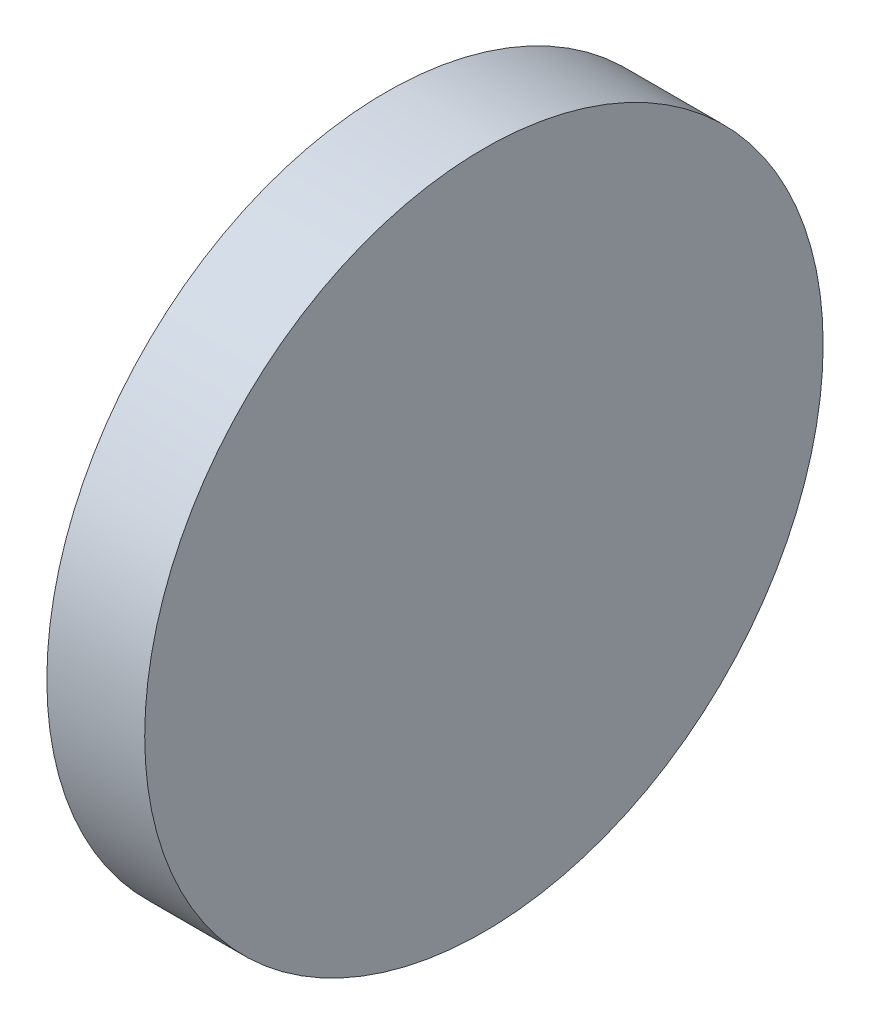
ISO-10303-21;
HEADER;
FILE_DESCRIPTION(('STEP AP214'),'2;1');
FILE_NAME('part.step','',(''),(''),'','','');
FILE_SCHEMA(('AUTOMOTIVE_DESIGN { 1 0 10303 214 1 1 1 1 }'));
ENDSEC;
DATA;
#1=APPLICATION_CONTEXT('core data for automotive mechanical design processes');
#2=APPLICATION_PROTOCOL_DEFINITION('international standard','automotive_design',2000,#1);
#3=PRODUCT_CONTEXT('',#1,'mechanical');
#4=PRODUCT('Part','Part','',(#3));
#5=PRODUCT_RELATED_PRODUCT_CATEGORY('part','',(#4));
#6=PRODUCT_DEFINITION_FORMATION('','',#4);
#7=PRODUCT_DEFINITION_CONTEXT('part definition',#1,'design');
#8=PRODUCT_DEFINITION('design','',#6,#7);
#9=PRODUCT_DEFINITION_SHAPE('','',#8);
#10=(LENGTH_UNIT() NAMED_UNIT(*) SI_UNIT(.MILLI.,.METRE.));
#11=(NAMED_UNIT(*) PLANE_ANGLE_UNIT() SI_UNIT($,.RADIAN.));
#12=(NAMED_UNIT(*) SI_UNIT($,.STERADIAN.) SOLID_ANGLE_UNIT());
#13=UNCERTAINTY_MEASURE_WITH_UNIT(LENGTH_MEASURE(1.E-05),#10,'distance_accuracy_value','');
#14=(GEOMETRIC_REPRESENTATION_CONTEXT(3) GLOBAL_UNCERTAINTY_ASSIGNED_CONTEXT((#13)) GLOBAL_UNIT_ASSIGNED_CONTEXT((#10,
#11,#12)) REPRESENTATION_CONTEXT('',''));
#15=CARTESIAN_POINT('',(0.,0.,0.));
#16=DIRECTION('',(0.,0.,1.));
#17=DIRECTION('',(1.,0.,0.));
#18=AXIS2_PLACEMENT_3D('',#15,#16,#17);
#19=CARTESIAN_POINT('',(0.,52.,0.));
#20=DIRECTION('',(1.,0.,0.));
#21=DIRECTION('',(0.,0.,-1.));
#22=AXIS2_PLACEMENT_3D('',#19,#20,#21);
#23=PLANE('',#22);
#24=CARTESIAN_POINT('',(0.,0.,0.));
#25=DIRECTION('',(-1.,0.,0.));
#26=DIRECTION('',(0.,0.,1.));
#27=AXIS2_PLACEMENT_3D('',#24,#25,#26);
#28=CIRCLE('',#27,52.);
#29=CARTESIAN_POINT('',(0.,0.,52.));
#30=VERTEX_POINT('',#29);
#31=EDGE_CURVE('E43',#30,#30,#28,.T.);
#32=ORIENTED_EDGE('',*,*,#31,.T.);
#33=EDGE_LOOP('',(#32));
#34=FACE_BOUND('',#33,.T.);
#35=ADVANCED_FACE('F37',(#34),#23,.F.);
#36=CARTESIAN_POINT('',(15.,0.,0.));
#37=DIRECTION('',(-1.,0.,0.));
#38=DIRECTION('',(0.,0.,1.));
#39=AXIS2_PLACEMENT_3D('',#36,#37,#38);
#40=PLANE('',#39);
#41=CARTESIAN_POINT('',(15.,0.,0.));
#42=DIRECTION('',(-1.,0.,0.));
#43=DIRECTION('',(0.,0.,1.));
#44=AXIS2_PLACEMENT_3D('',#41,#42,#43);
#45=CIRCLE('',#44,52.);
#46=CARTESIAN_POINT('',(15.,0.,52.));
#47=VERTEX_POINT('',#46);
#48=EDGE_CURVE('E10',#47,#47,#45,.T.);
#49=ORIENTED_EDGE('',*,*,#48,.F.);
#50=EDGE_LOOP('',(#49));
#51=FACE_BOUND('',#50,.T.);
#52=ADVANCED_FACE('F52',(#51),#40,.F.);
#53=CARTESIAN_POINT('',(0.,0.,0.));
#54=DIRECTION('',(-1.,0.,0.));
#55=DIRECTION('',(0.,0.,1.));
#56=AXIS2_PLACEMENT_3D('',#53,#54,#55);
#57=CYLINDRICAL_SURFACE('',#56,52.);
#58=ORIENTED_EDGE('',*,*,#31,.F.);
#59=EDGE_LOOP('',(#58));
#60=FACE_BOUND('',#59,.T.);
#61=ORIENTED_EDGE('',*,*,#48,.T.);
#62=EDGE_LOOP('',(#61));
#63=FACE_BOUND('',#62,.T.);
#64=ADVANCED_FACE('F50',(#60,#63),#57,.T.);
#65=CLOSED_SHELL('',(#35,#52,#64));
#66=MANIFOLD_SOLID_BREP('B2',#65);
#67=ADVANCED_BREP_SHAPE_REPRESENTATION('',(#18,#66),#14);
#68=SHAPE_DEFINITION_REPRESENTATION(#9,#67);
ENDSEC;
END-ISO-10303-21;
